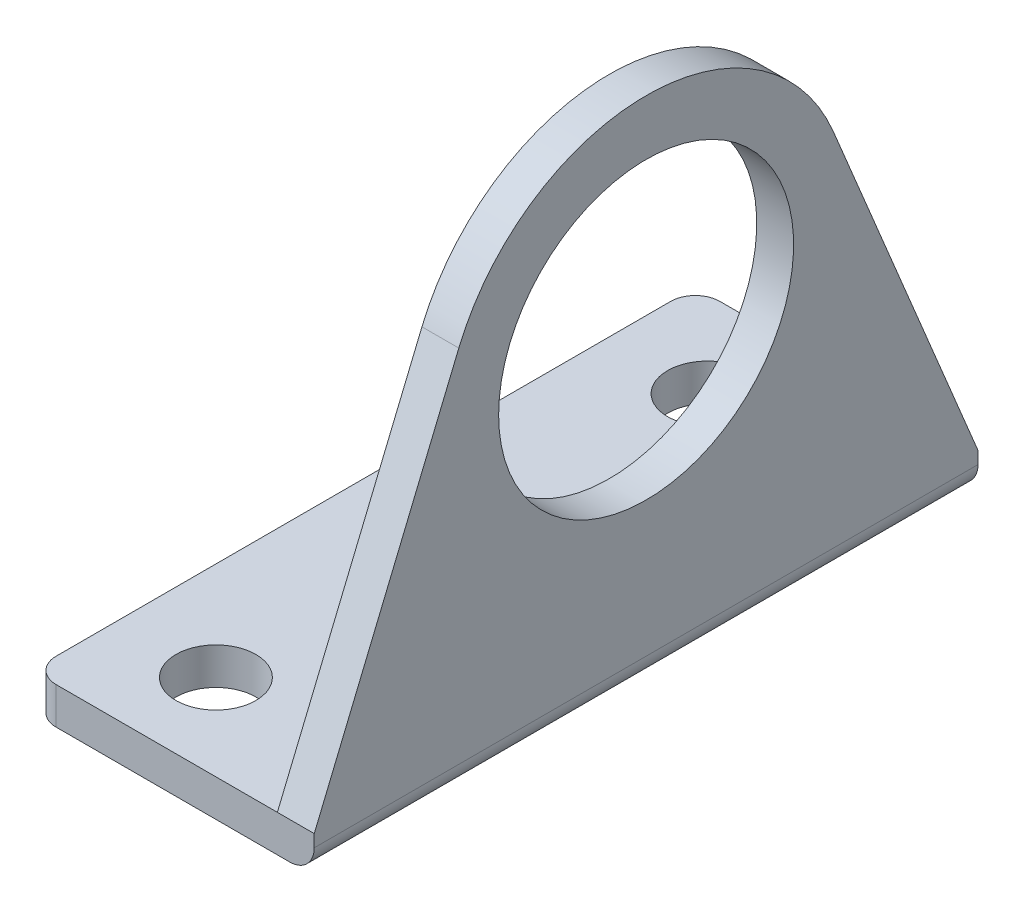
ISO-10303-21;
HEADER;
FILE_DESCRIPTION(('STEP AP214'),'2;1');
FILE_NAME('part.step','',(''),(''),'','','');
FILE_SCHEMA(('AUTOMOTIVE_DESIGN { 1 0 10303 214 1 1 1 1 }'));
ENDSEC;
DATA;
#1=APPLICATION_CONTEXT('core data for automotive mechanical design processes');
#2=APPLICATION_PROTOCOL_DEFINITION('international standard','automotive_design',2000,#1);
#3=PRODUCT_CONTEXT('',#1,'mechanical');
#4=PRODUCT('Part','Part','',(#3));
#5=PRODUCT_RELATED_PRODUCT_CATEGORY('part','',(#4));
#6=PRODUCT_DEFINITION_FORMATION('','',#4);
#7=PRODUCT_DEFINITION_CONTEXT('part definition',#1,'design');
#8=PRODUCT_DEFINITION('design','',#6,#7);
#9=PRODUCT_DEFINITION_SHAPE('','',#8);
#10=(LENGTH_UNIT() NAMED_UNIT(*) SI_UNIT(.MILLI.,.METRE.));
#11=(NAMED_UNIT(*) PLANE_ANGLE_UNIT() SI_UNIT($,.RADIAN.));
#12=(NAMED_UNIT(*) SI_UNIT($,.STERADIAN.) SOLID_ANGLE_UNIT());
#13=UNCERTAINTY_MEASURE_WITH_UNIT(LENGTH_MEASURE(1.E-05),#10,'distance_accuracy_value','');
#14=(GEOMETRIC_REPRESENTATION_CONTEXT(3) GLOBAL_UNCERTAINTY_ASSIGNED_CONTEXT((#13)) GLOBAL_UNIT_ASSIGNED_CONTEXT((#10,
#11,#12)) REPRESENTATION_CONTEXT('',''));
#15=CARTESIAN_POINT('',(0.,0.,0.));
#16=DIRECTION('',(0.,0.,1.));
#17=DIRECTION('',(1.,0.,0.));
#18=AXIS2_PLACEMENT_3D('',#15,#16,#17);
#19=CARTESIAN_POINT('',(-11.,-22.,0.));
#20=DIRECTION('',(-1.,0.,0.));
#21=DIRECTION('',(0.,0.,-1.));
#22=AXIS2_PLACEMENT_3D('',#19,#20,#21);
#23=PLANE('',#22);
#24=DIRECTION('',(0.,0.,1.));
#25=VECTOR('',#24,1.);
#26=CARTESIAN_POINT('',(-11.,-25.,25.));
#27=LINE('',#26,#25);
#28=CARTESIAN_POINT('',(-11.,-25.,-25.));
#29=VERTEX_POINT('',#28);
#30=CARTESIAN_POINT('',(-11.,-25.,25.));
#31=VERTEX_POINT('',#30);
#32=EDGE_CURVE('E119',#29,#31,#27,.T.);
#33=ORIENTED_EDGE('',*,*,#32,.T.);
#34=DIRECTION('',(0.,-1.,0.));
#35=VECTOR('',#34,1.);
#36=CARTESIAN_POINT('',(-11.,-22.,25.));
#37=LINE('',#36,#35);
#38=CARTESIAN_POINT('',(-11.,-22.,25.));
#39=VERTEX_POINT('',#38);
#40=EDGE_CURVE('E39',#39,#31,#37,.T.);
#41=ORIENTED_EDGE('',*,*,#40,.F.);
#42=DIRECTION('',(0.,0.,-1.));
#43=VECTOR('',#42,1.);
#44=CARTESIAN_POINT('',(-11.,-22.,25.));
#45=LINE('',#44,#43);
#46=CARTESIAN_POINT('',(-11.,-22.,-25.));
#47=VERTEX_POINT('',#46);
#48=EDGE_CURVE('E187',#39,#47,#45,.T.);
#49=ORIENTED_EDGE('',*,*,#48,.T.);
#50=DIRECTION('',(0.,-1.,0.));
#51=VECTOR('',#50,1.);
#52=CARTESIAN_POINT('',(-11.,-22.,-25.));
#53=LINE('',#52,#51);
#54=EDGE_CURVE('E10',#47,#29,#53,.T.);
#55=ORIENTED_EDGE('',*,*,#54,.T.);
#56=EDGE_LOOP('',(#33,#41,#49,#55));
#57=FACE_BOUND('',#56,.T.);
#58=ADVANCED_FACE('F16',(#57),#23,.T.);
#59=CARTESIAN_POINT('',(-9.,-22.,-25.));
#60=DIRECTION('',(0.,1.,0.));
#61=DIRECTION('',(0.,0.,-1.));
#62=AXIS2_PLACEMENT_3D('',#59,#60,#61);
#63=CYLINDRICAL_SURFACE('',#62,2.);
#64=CARTESIAN_POINT('',(-9.,-25.,-25.));
#65=DIRECTION('',(0.,1.,0.));
#66=DIRECTION('',(0.,0.,-1.));
#67=AXIS2_PLACEMENT_3D('',#64,#65,#66);
#68=CIRCLE('',#67,2.);
#69=CARTESIAN_POINT('',(-9.,-25.,-27.));
#70=VERTEX_POINT('',#69);
#71=EDGE_CURVE('E114',#70,#29,#68,.T.);
#72=ORIENTED_EDGE('',*,*,#71,.T.);
#73=ORIENTED_EDGE('',*,*,#54,.F.);
#74=CARTESIAN_POINT('',(-9.,-22.,-25.));
#75=DIRECTION('',(0.,-1.,0.));
#76=DIRECTION('',(0.,0.,-1.));
#77=AXIS2_PLACEMENT_3D('',#74,#75,#76);
#78=CIRCLE('',#77,2.);
#79=CARTESIAN_POINT('',(-9.,-22.,-27.));
#80=VERTEX_POINT('',#79);
#81=EDGE_CURVE('E148',#47,#80,#78,.T.);
#82=ORIENTED_EDGE('',*,*,#81,.T.);
#83=DIRECTION('',(0.,-1.,0.));
#84=VECTOR('',#83,1.);
#85=CARTESIAN_POINT('',(-9.,-22.,-27.));
#86=LINE('',#85,#84);
#87=EDGE_CURVE('E197',#80,#70,#86,.T.);
#88=ORIENTED_EDGE('',*,*,#87,.T.);
#89=EDGE_LOOP('',(#72,#73,#82,#88));
#90=FACE_BOUND('',#89,.T.);
#91=ADVANCED_FACE('F218',(#90),#63,.T.);
#92=CARTESIAN_POINT('',(12.,-22.,0.));
#93=DIRECTION('',(1.,0.,0.));
#94=DIRECTION('',(0.,0.,1.));
#95=AXIS2_PLACEMENT_3D('',#92,#93,#94);
#96=PLANE('',#95);
#97=CARTESIAN_POINT('',(12.,0.,0.));
#98=DIRECTION('',(-1.,0.,0.));
#99=DIRECTION('',(0.,0.,-1.));
#100=AXIS2_PLACEMENT_3D('',#97,#98,#99);
#101=CIRCLE('',#100,12.);
#102=CARTESIAN_POINT('',(12.,0.,12.));
#103=VERTEX_POINT('',#102);
#104=EDGE_CURVE('E110',#103,#103,#101,.T.);
#105=ORIENTED_EDGE('',*,*,#104,.T.);
#106=EDGE_LOOP('',(#105));
#107=FACE_BOUND('',#106,.T.);
#108=DIRECTION('',(0.,0.,-1.));
#109=VECTOR('',#108,1.);
#110=CARTESIAN_POINT('',(12.,-23.,0.));
#111=LINE('',#110,#109);
#112=CARTESIAN_POINT('',(12.,-23.,27.));
#113=VERTEX_POINT('',#112);
#114=CARTESIAN_POINT('',(12.,-23.,-27.));
#115=VERTEX_POINT('',#114);
#116=EDGE_CURVE('E158',#113,#115,#111,.T.);
#117=ORIENTED_EDGE('',*,*,#116,.T.);
#118=DIRECTION('',(0.,-1.,0.));
#119=VECTOR('',#118,1.);
#120=CARTESIAN_POINT('',(12.,-22.,-27.));
#121=LINE('',#120,#119);
#122=CARTESIAN_POINT('',(12.,-22.,-27.));
#123=VERTEX_POINT('',#122);
#124=EDGE_CURVE('E186',#123,#115,#121,.T.);
#125=ORIENTED_EDGE('',*,*,#124,.F.);
#126=DIRECTION('',(0.,-0.923558334060066,-0.383457955437354));
#127=VECTOR('',#126,1.);
#128=CARTESIAN_POINT('',(12.,-22.,-27.));
#129=LINE('',#128,#127);
#130=CARTESIAN_POINT('',(12.,6.32705626471634,-15.2387125119911));
#131=VERTEX_POINT('',#130);
#132=EDGE_CURVE('E142',#131,#123,#129,.T.);
#133=ORIENTED_EDGE('',*,*,#132,.F.);
#134=CARTESIAN_POINT('',(12.,0.,0.));
#135=DIRECTION('',(-1.,0.,0.));
#136=DIRECTION('',(0.,0.,-1.));
#137=AXIS2_PLACEMENT_3D('',#134,#135,#136);
#138=CIRCLE('',#137,16.5);
#139=CARTESIAN_POINT('',(12.,6.32705626471634,15.2387125119911));
#140=VERTEX_POINT('',#139);
#141=EDGE_CURVE('E134',#140,#131,#138,.T.);
#142=ORIENTED_EDGE('',*,*,#141,.F.);
#143=DIRECTION('',(0.,0.923558334060066,-0.383457955437354));
#144=VECTOR('',#143,1.);
#145=CARTESIAN_POINT('',(12.,-22.,27.));
#146=LINE('',#145,#144);
#147=CARTESIAN_POINT('',(12.,-22.,27.));
#148=VERTEX_POINT('',#147);
#149=EDGE_CURVE('E116',#148,#140,#146,.T.);
#150=ORIENTED_EDGE('',*,*,#149,.F.);
#151=DIRECTION('',(0.,-1.,0.));
#152=VECTOR('',#151,1.);
#153=CARTESIAN_POINT('',(12.,-22.,27.));
#154=LINE('',#153,#152);
#155=EDGE_CURVE('E24',#148,#113,#154,.T.);
#156=ORIENTED_EDGE('',*,*,#155,.T.);
#157=EDGE_LOOP('',(#117,#125,#133,#142,#150,#156));
#158=FACE_BOUND('',#157,.T.);
#159=ADVANCED_FACE('F18',(#107,#158),#96,.T.);
#160=CARTESIAN_POINT('',(1.5,-22.,27.));
#161=DIRECTION('',(0.,0.,1.));
#162=DIRECTION('',(-1.,0.,0.));
#163=AXIS2_PLACEMENT_3D('',#160,#161,#162);
#164=PLANE('',#163);
#165=CARTESIAN_POINT('',(10.,-23.,27.));
#166=DIRECTION('',(0.,0.,1.));
#167=DIRECTION('',(0.,-1.,0.));
#168=AXIS2_PLACEMENT_3D('',#165,#166,#167);
#169=CIRCLE('',#168,2.);
#170=CARTESIAN_POINT('',(10.,-25.,27.));
#171=VERTEX_POINT('',#170);
#172=EDGE_CURVE('E163',#171,#113,#169,.T.);
#173=ORIENTED_EDGE('',*,*,#172,.T.);
#174=ORIENTED_EDGE('',*,*,#155,.F.);
#175=DIRECTION('',(-1.,0.,0.));
#176=VECTOR('',#175,1.);
#177=CARTESIAN_POINT('',(12.,-22.,27.));
#178=LINE('',#177,#176);
#179=CARTESIAN_POINT('',(9.,-22.,27.));
#180=VERTEX_POINT('',#179);
#181=EDGE_CURVE('E131',#148,#180,#178,.T.);
#182=ORIENTED_EDGE('',*,*,#181,.T.);
#183=DIRECTION('',(-1.,0.,0.));
#184=VECTOR('',#183,1.);
#185=CARTESIAN_POINT('',(12.,-22.,27.));
#186=LINE('',#185,#184);
#187=CARTESIAN_POINT('',(-9.,-22.,27.));
#188=VERTEX_POINT('',#187);
#189=EDGE_CURVE('E149',#180,#188,#186,.T.);
#190=ORIENTED_EDGE('',*,*,#189,.T.);
#191=DIRECTION('',(0.,-1.,0.));
#192=VECTOR('',#191,1.);
#193=CARTESIAN_POINT('',(-9.,-22.,27.));
#194=LINE('',#193,#192);
#195=CARTESIAN_POINT('',(-9.,-25.,27.));
#196=VERTEX_POINT('',#195);
#197=EDGE_CURVE('E31',#188,#196,#194,.T.);
#198=ORIENTED_EDGE('',*,*,#197,.T.);
#199=DIRECTION('',(1.,0.,0.));
#200=VECTOR('',#199,1.);
#201=CARTESIAN_POINT('',(12.,-25.,27.));
#202=LINE('',#201,#200);
#203=EDGE_CURVE('E166',#196,#171,#202,.T.);
#204=ORIENTED_EDGE('',*,*,#203,.T.);
#205=EDGE_LOOP('',(#173,#174,#182,#190,#198,#204));
#206=FACE_BOUND('',#205,.T.);
#207=ADVANCED_FACE('F164',(#206),#164,.T.);
#208=CARTESIAN_POINT('',(-9.,-22.,25.));
#209=DIRECTION('',(0.,1.,0.));
#210=DIRECTION('',(0.,0.,-1.));
#211=AXIS2_PLACEMENT_3D('',#208,#209,#210);
#212=CYLINDRICAL_SURFACE('',#211,2.);
#213=CARTESIAN_POINT('',(-9.,-25.,25.));
#214=DIRECTION('',(0.,1.,0.));
#215=DIRECTION('',(0.,0.,-1.));
#216=AXIS2_PLACEMENT_3D('',#213,#214,#215);
#217=CIRCLE('',#216,2.);
#218=EDGE_CURVE('E185',#31,#196,#217,.T.);
#219=ORIENTED_EDGE('',*,*,#218,.T.);
#220=ORIENTED_EDGE('',*,*,#197,.F.);
#221=CARTESIAN_POINT('',(-9.,-22.,25.));
#222=DIRECTION('',(0.,-1.,0.));
#223=DIRECTION('',(0.,0.,-1.));
#224=AXIS2_PLACEMENT_3D('',#221,#222,#223);
#225=CIRCLE('',#224,2.);
#226=EDGE_CURVE('E151',#188,#39,#225,.T.);
#227=ORIENTED_EDGE('',*,*,#226,.T.);
#228=ORIENTED_EDGE('',*,*,#40,.T.);
#229=EDGE_LOOP('',(#219,#220,#227,#228));
#230=FACE_BOUND('',#229,.T.);
#231=ADVANCED_FACE('F207',(#230),#212,.T.);
#232=CARTESIAN_POINT('',(0.634491366874853,-22.,0.));
#233=DIRECTION('',(0.,-1.,0.));
#234=DIRECTION('',(0.,0.,-1.));
#235=AXIS2_PLACEMENT_3D('',#232,#233,#234);
#236=PLANE('',#235);
#237=DIRECTION('',(0.,0.,-1.));
#238=VECTOR('',#237,1.);
#239=CARTESIAN_POINT('',(9.,-22.,0.));
#240=LINE('',#239,#238);
#241=CARTESIAN_POINT('',(9.,-22.,-27.));
#242=VERTEX_POINT('',#241);
#243=EDGE_CURVE('E146',#180,#242,#240,.T.);
#244=ORIENTED_EDGE('',*,*,#243,.T.);
#245=DIRECTION('',(1.,0.,0.));
#246=VECTOR('',#245,1.);
#247=CARTESIAN_POINT('',(-9.,-22.,-27.));
#248=LINE('',#247,#246);
#249=EDGE_CURVE('E200',#80,#242,#248,.T.);
#250=ORIENTED_EDGE('',*,*,#249,.F.);
#251=ORIENTED_EDGE('',*,*,#81,.F.);
#252=ORIENTED_EDGE('',*,*,#48,.F.);
#253=ORIENTED_EDGE('',*,*,#226,.F.);
#254=ORIENTED_EDGE('',*,*,#189,.F.);
#255=EDGE_LOOP('',(#244,#250,#251,#252,#253,#254));
#256=FACE_BOUND('',#255,.T.);
#257=CARTESIAN_POINT('',(-3.,-22.,20.));
#258=DIRECTION('',(0.,-1.,0.));
#259=DIRECTION('',(1.,0.,0.));
#260=AXIS2_PLACEMENT_3D('',#257,#258,#259);
#261=CIRCLE('',#260,3.25);
#262=CARTESIAN_POINT('',(-6.25,-22.,20.));
#263=VERTEX_POINT('',#262);
#264=EDGE_CURVE('E181',#263,#263,#261,.T.);
#265=ORIENTED_EDGE('',*,*,#264,.T.);
#266=EDGE_LOOP('',(#265));
#267=FACE_BOUND('',#266,.T.);
#268=CARTESIAN_POINT('',(-3.,-22.,-20.));
#269=DIRECTION('',(0.,-1.,0.));
#270=DIRECTION('',(1.,0.,0.));
#271=AXIS2_PLACEMENT_3D('',#268,#269,#270);
#272=CIRCLE('',#271,3.25);
#273=CARTESIAN_POINT('',(-6.25,-22.,-20.));
#274=VERTEX_POINT('',#273);
#275=EDGE_CURVE('E240',#274,#274,#272,.T.);
#276=ORIENTED_EDGE('',*,*,#275,.T.);
#277=EDGE_LOOP('',(#276));
#278=FACE_BOUND('',#277,.T.);
#279=ADVANCED_FACE('F212',(#256,#267,#278),#236,.F.);
#280=CARTESIAN_POINT('',(9.,-7.72618153802992,0.));
#281=DIRECTION('',(1.,0.,0.));
#282=DIRECTION('',(0.,0.,-1.));
#283=AXIS2_PLACEMENT_3D('',#280,#281,#282);
#284=PLANE('',#283);
#285=ORIENTED_EDGE('',*,*,#243,.F.);
#286=DIRECTION('',(0.,0.923558334060066,-0.383457955437354));
#287=VECTOR('',#286,1.);
#288=CARTESIAN_POINT('',(9.,-22.,27.));
#289=LINE('',#288,#287);
#290=CARTESIAN_POINT('',(9.,6.32705626471634,15.2387125119911));
#291=VERTEX_POINT('',#290);
#292=EDGE_CURVE('E128',#180,#291,#289,.T.);
#293=ORIENTED_EDGE('',*,*,#292,.T.);
#294=CARTESIAN_POINT('',(9.,0.,0.));
#295=DIRECTION('',(1.,0.,0.));
#296=DIRECTION('',(0.,0.,-1.));
#297=AXIS2_PLACEMENT_3D('',#294,#295,#296);
#298=CIRCLE('',#297,16.5);
#299=CARTESIAN_POINT('',(9.,6.32705626471634,-15.2387125119911));
#300=VERTEX_POINT('',#299);
#301=EDGE_CURVE('E140',#300,#291,#298,.T.);
#302=ORIENTED_EDGE('',*,*,#301,.F.);
#303=DIRECTION('',(0.,0.923558334060066,0.383457955437354));
#304=VECTOR('',#303,1.);
#305=CARTESIAN_POINT('',(9.,-22.,-27.));
#306=LINE('',#305,#304);
#307=EDGE_CURVE('E144',#242,#300,#306,.T.);
#308=ORIENTED_EDGE('',*,*,#307,.F.);
#309=EDGE_LOOP('',(#285,#293,#302,#308));
#310=FACE_BOUND('',#309,.T.);
#311=CARTESIAN_POINT('',(9.,0.,0.));
#312=DIRECTION('',(1.,0.,0.));
#313=DIRECTION('',(0.,0.,-1.));
#314=AXIS2_PLACEMENT_3D('',#311,#312,#313);
#315=CIRCLE('',#314,12.);
#316=CARTESIAN_POINT('',(9.,0.,12.));
#317=VERTEX_POINT('',#316);
#318=EDGE_CURVE('E113',#317,#317,#315,.T.);
#319=ORIENTED_EDGE('',*,*,#318,.T.);
#320=EDGE_LOOP('',(#319));
#321=FACE_BOUND('',#320,.T.);
#322=ADVANCED_FACE('F235',(#310,#321),#284,.F.);
#323=CARTESIAN_POINT('',(9.,-7.83647186764183,-21.1193562559956));
#324=DIRECTION('',(0.,0.383457955437354,-0.923558334060066));
#325=DIRECTION('',(0.,0.923558334060066,0.383457955437354));
#326=AXIS2_PLACEMENT_3D('',#323,#324,#325);
#327=PLANE('',#326);
#328=ORIENTED_EDGE('',*,*,#132,.T.);
#329=DIRECTION('',(1.,0.,0.));
#330=VECTOR('',#329,1.);
#331=CARTESIAN_POINT('',(-9.,-22.,-27.));
#332=LINE('',#331,#330);
#333=EDGE_CURVE('E194',#242,#123,#332,.T.);
#334=ORIENTED_EDGE('',*,*,#333,.F.);
#335=ORIENTED_EDGE('',*,*,#307,.T.);
#336=DIRECTION('',(1.,0.,0.));
#337=VECTOR('',#336,1.);
#338=CARTESIAN_POINT('',(9.,6.32705626471634,-15.2387125119911));
#339=LINE('',#338,#337);
#340=EDGE_CURVE('E137',#300,#131,#339,.T.);
#341=ORIENTED_EDGE('',*,*,#340,.T.);
#342=EDGE_LOOP('',(#328,#334,#335,#341));
#343=FACE_BOUND('',#342,.T.);
#344=ADVANCED_FACE('F224',(#343),#327,.T.);
#345=CARTESIAN_POINT('',(9.,0.,0.));
#346=DIRECTION('',(-1.,0.,0.));
#347=DIRECTION('',(0.,0.,-1.));
#348=AXIS2_PLACEMENT_3D('',#345,#346,#347);
#349=CYLINDRICAL_SURFACE('',#348,16.5);
#350=ORIENTED_EDGE('',*,*,#141,.T.);
#351=ORIENTED_EDGE('',*,*,#340,.F.);
#352=ORIENTED_EDGE('',*,*,#301,.T.);
#353=DIRECTION('',(1.,0.,0.));
#354=VECTOR('',#353,1.);
#355=CARTESIAN_POINT('',(9.,6.32705626471634,15.2387125119911));
#356=LINE('',#355,#354);
#357=EDGE_CURVE('E125',#291,#140,#356,.T.);
#358=ORIENTED_EDGE('',*,*,#357,.T.);
#359=EDGE_LOOP('',(#350,#351,#352,#358));
#360=FACE_BOUND('',#359,.T.);
#361=ADVANCED_FACE('F228',(#360),#349,.T.);
#362=CARTESIAN_POINT('',(9.,-7.83647186764183,21.1193562559956));
#363=DIRECTION('',(0.,0.383457955437354,0.923558334060066));
#364=DIRECTION('',(0.,-0.923558334060066,0.383457955437354));
#365=AXIS2_PLACEMENT_3D('',#362,#363,#364);
#366=PLANE('',#365);
#367=ORIENTED_EDGE('',*,*,#149,.T.);
#368=ORIENTED_EDGE('',*,*,#357,.F.);
#369=ORIENTED_EDGE('',*,*,#292,.F.);
#370=ORIENTED_EDGE('',*,*,#181,.F.);
#371=EDGE_LOOP('',(#367,#368,#369,#370));
#372=FACE_BOUND('',#371,.T.);
#373=ADVANCED_FACE('F232',(#372),#366,.T.);
#374=CARTESIAN_POINT('',(6.5,0.,0.));
#375=DIRECTION('',(-1.,0.,0.));
#376=DIRECTION('',(0.,0.,-1.));
#377=AXIS2_PLACEMENT_3D('',#374,#375,#376);
#378=CYLINDRICAL_SURFACE('',#377,12.);
#379=ORIENTED_EDGE('',*,*,#318,.F.);
#380=EDGE_LOOP('',(#379));
#381=FACE_BOUND('',#380,.T.);
#382=ORIENTED_EDGE('',*,*,#104,.F.);
#383=EDGE_LOOP('',(#382));
#384=FACE_BOUND('',#383,.T.);
#385=ADVANCED_FACE('F271',(#381,#384),#378,.F.);
#386=CARTESIAN_POINT('',(0.634491366874853,-25.,0.));
#387=DIRECTION('',(0.,-1.,0.));
#388=DIRECTION('',(0.,0.,-1.));
#389=AXIS2_PLACEMENT_3D('',#386,#387,#388);
#390=PLANE('',#389);
#391=DIRECTION('',(0.,0.,-1.));
#392=VECTOR('',#391,1.);
#393=CARTESIAN_POINT('',(10.,-25.,0.));
#394=LINE('',#393,#392);
#395=CARTESIAN_POINT('',(10.,-25.,-27.));
#396=VERTEX_POINT('',#395);
#397=EDGE_CURVE('E170',#171,#396,#394,.T.);
#398=ORIENTED_EDGE('',*,*,#397,.F.);
#399=ORIENTED_EDGE('',*,*,#203,.F.);
#400=ORIENTED_EDGE('',*,*,#218,.F.);
#401=ORIENTED_EDGE('',*,*,#32,.F.);
#402=ORIENTED_EDGE('',*,*,#71,.F.);
#403=DIRECTION('',(-1.,0.,0.));
#404=VECTOR('',#403,1.);
#405=CARTESIAN_POINT('',(-9.,-25.,-27.));
#406=LINE('',#405,#404);
#407=EDGE_CURVE('E192',#396,#70,#406,.T.);
#408=ORIENTED_EDGE('',*,*,#407,.F.);
#409=EDGE_LOOP('',(#398,#399,#400,#401,#402,#408));
#410=FACE_BOUND('',#409,.T.);
#411=CARTESIAN_POINT('',(-3.,-25.,20.));
#412=DIRECTION('',(0.,1.,0.));
#413=DIRECTION('',(1.,0.,0.));
#414=AXIS2_PLACEMENT_3D('',#411,#412,#413);
#415=CIRCLE('',#414,3.25);
#416=CARTESIAN_POINT('',(-6.25,-25.,20.));
#417=VERTEX_POINT('',#416);
#418=EDGE_CURVE('E176',#417,#417,#415,.T.);
#419=ORIENTED_EDGE('',*,*,#418,.T.);
#420=EDGE_LOOP('',(#419));
#421=FACE_BOUND('',#420,.T.);
#422=CARTESIAN_POINT('',(-3.,-25.,-20.));
#423=DIRECTION('',(0.,1.,0.));
#424=DIRECTION('',(1.,0.,0.));
#425=AXIS2_PLACEMENT_3D('',#422,#423,#424);
#426=CIRCLE('',#425,3.25);
#427=CARTESIAN_POINT('',(-6.25,-25.,-20.));
#428=VERTEX_POINT('',#427);
#429=EDGE_CURVE('E182',#428,#428,#426,.T.);
#430=ORIENTED_EDGE('',*,*,#429,.T.);
#431=EDGE_LOOP('',(#430));
#432=FACE_BOUND('',#431,.T.);
#433=ADVANCED_FACE('F205',(#410,#421,#432),#390,.T.);
#434=CARTESIAN_POINT('',(1.5,-22.,-27.));
#435=DIRECTION('',(0.,0.,-1.));
#436=DIRECTION('',(1.,0.,0.));
#437=AXIS2_PLACEMENT_3D('',#434,#435,#436);
#438=PLANE('',#437);
#439=CARTESIAN_POINT('',(10.,-23.,-27.));
#440=DIRECTION('',(0.,0.,-1.));
#441=DIRECTION('',(0.,-1.,0.));
#442=AXIS2_PLACEMENT_3D('',#439,#440,#441);
#443=CIRCLE('',#442,2.);
#444=EDGE_CURVE('E174',#115,#396,#443,.T.);
#445=ORIENTED_EDGE('',*,*,#444,.T.);
#446=ORIENTED_EDGE('',*,*,#407,.T.);
#447=ORIENTED_EDGE('',*,*,#87,.F.);
#448=ORIENTED_EDGE('',*,*,#249,.T.);
#449=ORIENTED_EDGE('',*,*,#333,.T.);
#450=ORIENTED_EDGE('',*,*,#124,.T.);
#451=EDGE_LOOP('',(#445,#446,#447,#448,#449,#450));
#452=FACE_BOUND('',#451,.T.);
#453=ADVANCED_FACE('F220',(#452),#438,.T.);
#454=CARTESIAN_POINT('',(10.,-23.,-28.));
#455=DIRECTION('',(0.,0.,-1.));
#456=DIRECTION('',(0.,-1.,0.));
#457=AXIS2_PLACEMENT_3D('',#454,#455,#456);
#458=CYLINDRICAL_SURFACE('',#457,2.);
#459=ORIENTED_EDGE('',*,*,#444,.F.);
#460=ORIENTED_EDGE('',*,*,#116,.F.);
#461=ORIENTED_EDGE('',*,*,#172,.F.);
#462=ORIENTED_EDGE('',*,*,#397,.T.);
#463=EDGE_LOOP('',(#459,#460,#461,#462));
#464=FACE_BOUND('',#463,.T.);
#465=ADVANCED_FACE('F172',(#464),#458,.T.);
#466=CARTESIAN_POINT('',(-3.,-23.5,20.));
#467=DIRECTION('',(0.,1.,0.));
#468=DIRECTION('',(1.,0.,0.));
#469=AXIS2_PLACEMENT_3D('',#466,#467,#468);
#470=CYLINDRICAL_SURFACE('',#469,3.25);
#471=ORIENTED_EDGE('',*,*,#418,.F.);
#472=EDGE_LOOP('',(#471));
#473=FACE_BOUND('',#472,.T.);
#474=ORIENTED_EDGE('',*,*,#264,.F.);
#475=EDGE_LOOP('',(#474));
#476=FACE_BOUND('',#475,.T.);
#477=ADVANCED_FACE('F247',(#473,#476),#470,.F.);
#478=CARTESIAN_POINT('',(-3.,-23.5,-20.));
#479=DIRECTION('',(0.,1.,0.));
#480=DIRECTION('',(1.,0.,0.));
#481=AXIS2_PLACEMENT_3D('',#478,#479,#480);
#482=CYLINDRICAL_SURFACE('',#481,3.25);
#483=ORIENTED_EDGE('',*,*,#429,.F.);
#484=EDGE_LOOP('',(#483));
#485=FACE_BOUND('',#484,.T.);
#486=ORIENTED_EDGE('',*,*,#275,.F.);
#487=EDGE_LOOP('',(#486));
#488=FACE_BOUND('',#487,.T.);
#489=ADVANCED_FACE('F244',(#485,#488),#482,.F.);
#490=CLOSED_SHELL('',(#58,#91,#159,#207,#231,#279,#322,#344,#361,#373,#385,#433,#453,#465,#477,#489));
#491=MANIFOLD_SOLID_BREP('B1',#490);
#492=ADVANCED_BREP_SHAPE_REPRESENTATION('',(#18,#491),#14);
#493=SHAPE_DEFINITION_REPRESENTATION(#9,#492);
ENDSEC;
END-ISO-10303-21;
